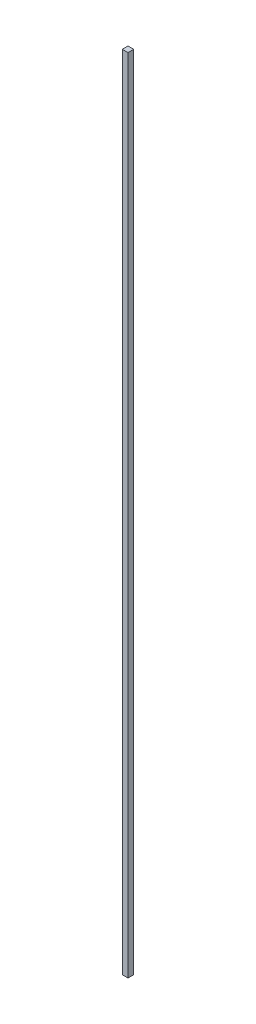
ISO-10303-21;
HEADER;
FILE_DESCRIPTION(('STEP AP214'),'2;1');
FILE_NAME('part.step','',(''),(''),'','','');
FILE_SCHEMA(('AUTOMOTIVE_DESIGN { 1 0 10303 214 1 1 1 1 }'));
ENDSEC;
DATA;
#1=APPLICATION_CONTEXT('core data for automotive mechanical design processes');
#2=APPLICATION_PROTOCOL_DEFINITION('international standard','automotive_design',2000,#1);
#3=PRODUCT_CONTEXT('',#1,'mechanical');
#4=PRODUCT('Part','Part','',(#3));
#5=PRODUCT_RELATED_PRODUCT_CATEGORY('part','',(#4));
#6=PRODUCT_DEFINITION_FORMATION('','',#4);
#7=PRODUCT_DEFINITION_CONTEXT('part definition',#1,'design');
#8=PRODUCT_DEFINITION('design','',#6,#7);
#9=PRODUCT_DEFINITION_SHAPE('','',#8);
#10=(LENGTH_UNIT() NAMED_UNIT(*) SI_UNIT(.MILLI.,.METRE.));
#11=(NAMED_UNIT(*) PLANE_ANGLE_UNIT() SI_UNIT($,.RADIAN.));
#12=(NAMED_UNIT(*) SI_UNIT($,.STERADIAN.) SOLID_ANGLE_UNIT());
#13=UNCERTAINTY_MEASURE_WITH_UNIT(LENGTH_MEASURE(1.E-05),#10,'distance_accuracy_value','');
#14=(GEOMETRIC_REPRESENTATION_CONTEXT(3) GLOBAL_UNCERTAINTY_ASSIGNED_CONTEXT((#13)) GLOBAL_UNIT_ASSIGNED_CONTEXT((#10,
#11,#12)) REPRESENTATION_CONTEXT('',''));
#15=CARTESIAN_POINT('',(0.,0.,0.));
#16=DIRECTION('',(0.,0.,1.));
#17=DIRECTION('',(1.,0.,0.));
#18=AXIS2_PLACEMENT_3D('',#15,#16,#17);
#19=CARTESIAN_POINT('',(0.25,70.,-0.25));
#20=DIRECTION('',(-1.,0.,0.));
#21=DIRECTION('',(0.,0.,1.));
#22=AXIS2_PLACEMENT_3D('',#19,#20,#21);
#23=PLANE('',#22);
#24=DIRECTION('',(0.,0.,-1.));
#25=VECTOR('',#24,1.);
#26=CARTESIAN_POINT('',(0.25,0.,-0.25));
#27=LINE('',#26,#25);
#28=CARTESIAN_POINT('',(0.25,0.,0.25));
#29=VERTEX_POINT('',#28);
#30=CARTESIAN_POINT('',(0.25,0.,-0.25));
#31=VERTEX_POINT('',#30);
#32=EDGE_CURVE('E107',#29,#31,#27,.T.);
#33=ORIENTED_EDGE('',*,*,#32,.T.);
#34=DIRECTION('',(0.,-1.,0.));
#35=VECTOR('',#34,1.);
#36=CARTESIAN_POINT('',(0.25,70.,-0.25));
#37=LINE('',#36,#35);
#38=CARTESIAN_POINT('',(0.25,70.,-0.25));
#39=VERTEX_POINT('',#38);
#40=EDGE_CURVE('E11',#39,#31,#37,.T.);
#41=ORIENTED_EDGE('',*,*,#40,.F.);
#42=DIRECTION('',(0.,0.,-1.));
#43=VECTOR('',#42,1.);
#44=CARTESIAN_POINT('',(0.25,70.,-0.25));
#45=LINE('',#44,#43);
#46=CARTESIAN_POINT('',(0.25,70.,0.25));
#47=VERTEX_POINT('',#46);
#48=EDGE_CURVE('E91',#47,#39,#45,.T.);
#49=ORIENTED_EDGE('',*,*,#48,.F.);
#50=DIRECTION('',(0.,-1.,0.));
#51=VECTOR('',#50,1.);
#52=CARTESIAN_POINT('',(0.25,70.,0.25));
#53=LINE('',#52,#51);
#54=EDGE_CURVE('E103',#47,#29,#53,.T.);
#55=ORIENTED_EDGE('',*,*,#54,.T.);
#56=EDGE_LOOP('',(#33,#41,#49,#55));
#57=FACE_BOUND('',#56,.T.);
#58=ADVANCED_FACE('F39',(#57),#23,.F.);
#59=CARTESIAN_POINT('',(-0.25,70.,-0.25));
#60=DIRECTION('',(0.,0.,1.));
#61=DIRECTION('',(1.,0.,0.));
#62=AXIS2_PLACEMENT_3D('',#59,#60,#61);
#63=PLANE('',#62);
#64=DIRECTION('',(-1.,0.,0.));
#65=VECTOR('',#64,1.);
#66=CARTESIAN_POINT('',(-0.25,0.,-0.25));
#67=LINE('',#66,#65);
#68=CARTESIAN_POINT('',(-0.25,0.,-0.25));
#69=VERTEX_POINT('',#68);
#70=EDGE_CURVE('E96',#31,#69,#67,.T.);
#71=ORIENTED_EDGE('',*,*,#70,.T.);
#72=DIRECTION('',(0.,-1.,0.));
#73=VECTOR('',#72,1.);
#74=CARTESIAN_POINT('',(-0.25,70.,-0.25));
#75=LINE('',#74,#73);
#76=CARTESIAN_POINT('',(-0.25,70.,-0.25));
#77=VERTEX_POINT('',#76);
#78=EDGE_CURVE('E48',#77,#69,#75,.T.);
#79=ORIENTED_EDGE('',*,*,#78,.F.);
#80=DIRECTION('',(-1.,0.,0.));
#81=VECTOR('',#80,1.);
#82=CARTESIAN_POINT('',(-0.25,70.,-0.25));
#83=LINE('',#82,#81);
#84=EDGE_CURVE('E86',#39,#77,#83,.T.);
#85=ORIENTED_EDGE('',*,*,#84,.F.);
#86=ORIENTED_EDGE('',*,*,#40,.T.);
#87=EDGE_LOOP('',(#71,#79,#85,#86));
#88=FACE_BOUND('',#87,.T.);
#89=ADVANCED_FACE('F95',(#88),#63,.F.);
#90=CARTESIAN_POINT('',(-0.25,70.,-0.25));
#91=DIRECTION('',(1.,0.,0.));
#92=DIRECTION('',(0.,0.,-1.));
#93=AXIS2_PLACEMENT_3D('',#90,#91,#92);
#94=PLANE('',#93);
#95=DIRECTION('',(0.,0.,1.));
#96=VECTOR('',#95,1.);
#97=CARTESIAN_POINT('',(-0.25,0.,-0.25));
#98=LINE('',#97,#96);
#99=CARTESIAN_POINT('',(-0.25,0.,0.25));
#100=VERTEX_POINT('',#99);
#101=EDGE_CURVE('E73',#69,#100,#98,.T.);
#102=ORIENTED_EDGE('',*,*,#101,.T.);
#103=DIRECTION('',(0.,-1.,0.));
#104=VECTOR('',#103,1.);
#105=CARTESIAN_POINT('',(-0.25,70.,0.25));
#106=LINE('',#105,#104);
#107=CARTESIAN_POINT('',(-0.25,70.,0.25));
#108=VERTEX_POINT('',#107);
#109=EDGE_CURVE('E98',#108,#100,#106,.T.);
#110=ORIENTED_EDGE('',*,*,#109,.F.);
#111=DIRECTION('',(0.,0.,1.));
#112=VECTOR('',#111,1.);
#113=CARTESIAN_POINT('',(-0.25,70.,-0.25));
#114=LINE('',#113,#112);
#115=EDGE_CURVE('E89',#77,#108,#114,.T.);
#116=ORIENTED_EDGE('',*,*,#115,.F.);
#117=ORIENTED_EDGE('',*,*,#78,.T.);
#118=EDGE_LOOP('',(#102,#110,#116,#117));
#119=FACE_BOUND('',#118,.T.);
#120=ADVANCED_FACE('F99',(#119),#94,.F.);
#121=CARTESIAN_POINT('',(-0.25,70.,0.25));
#122=DIRECTION('',(0.,0.,-1.));
#123=DIRECTION('',(-1.,0.,0.));
#124=AXIS2_PLACEMENT_3D('',#121,#122,#123);
#125=PLANE('',#124);
#126=DIRECTION('',(1.,0.,0.));
#127=VECTOR('',#126,1.);
#128=CARTESIAN_POINT('',(-0.25,0.,0.25));
#129=LINE('',#128,#127);
#130=EDGE_CURVE('E79',#100,#29,#129,.T.);
#131=ORIENTED_EDGE('',*,*,#130,.T.);
#132=ORIENTED_EDGE('',*,*,#54,.F.);
#133=DIRECTION('',(1.,0.,0.));
#134=VECTOR('',#133,1.);
#135=CARTESIAN_POINT('',(-0.25,70.,0.25));
#136=LINE('',#135,#134);
#137=EDGE_CURVE('E56',#108,#47,#136,.T.);
#138=ORIENTED_EDGE('',*,*,#137,.F.);
#139=ORIENTED_EDGE('',*,*,#109,.T.);
#140=EDGE_LOOP('',(#131,#132,#138,#139));
#141=FACE_BOUND('',#140,.T.);
#142=ADVANCED_FACE('F120',(#141),#125,.F.);
#143=CARTESIAN_POINT('',(0.,70.,0.));
#144=DIRECTION('',(0.,1.,0.));
#145=DIRECTION('',(0.,0.,1.));
#146=AXIS2_PLACEMENT_3D('',#143,#144,#145);
#147=PLANE('',#146);
#148=ORIENTED_EDGE('',*,*,#48,.T.);
#149=ORIENTED_EDGE('',*,*,#84,.T.);
#150=ORIENTED_EDGE('',*,*,#115,.T.);
#151=ORIENTED_EDGE('',*,*,#137,.T.);
#152=EDGE_LOOP('',(#148,#149,#150,#151));
#153=FACE_BOUND('',#152,.T.);
#154=ADVANCED_FACE('F87',(#153),#147,.T.);
#155=CARTESIAN_POINT('',(0.,0.,0.));
#156=DIRECTION('',(0.,1.,0.));
#157=DIRECTION('',(0.,0.,1.));
#158=AXIS2_PLACEMENT_3D('',#155,#156,#157);
#159=PLANE('',#158);
#160=ORIENTED_EDGE('',*,*,#32,.F.);
#161=ORIENTED_EDGE('',*,*,#130,.F.);
#162=ORIENTED_EDGE('',*,*,#101,.F.);
#163=ORIENTED_EDGE('',*,*,#70,.F.);
#164=EDGE_LOOP('',(#160,#161,#162,#163));
#165=FACE_BOUND('',#164,.T.);
#166=ADVANCED_FACE('F123',(#165),#159,.F.);
#167=CLOSED_SHELL('',(#58,#89,#120,#142,#154,#166));
#168=MANIFOLD_SOLID_BREP('B2',#167);
#169=ADVANCED_BREP_SHAPE_REPRESENTATION('',(#18,#168),#14);
#170=SHAPE_DEFINITION_REPRESENTATION(#9,#169);
ENDSEC;
END-ISO-10303-21;
